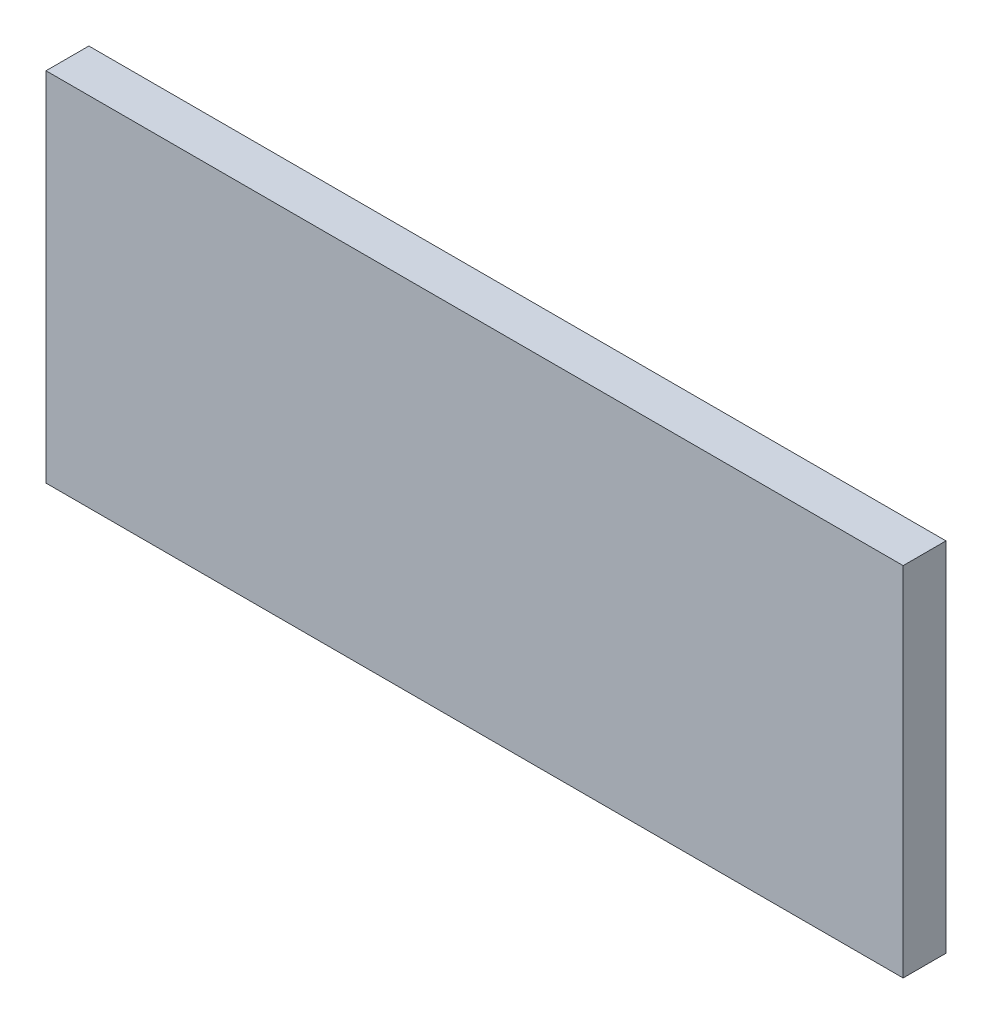
ISO-10303-21;
HEADER;
FILE_DESCRIPTION(('STEP AP214'),'2;1');
FILE_NAME('part.step','',(''),(''),'','','');
FILE_SCHEMA(('AUTOMOTIVE_DESIGN { 1 0 10303 214 1 1 1 1 }'));
ENDSEC;
DATA;
#1=APPLICATION_CONTEXT('core data for automotive mechanical design processes');
#2=APPLICATION_PROTOCOL_DEFINITION('international standard','automotive_design',2000,#1);
#3=PRODUCT_CONTEXT('',#1,'mechanical');
#4=PRODUCT('Part','Part','',(#3));
#5=PRODUCT_RELATED_PRODUCT_CATEGORY('part','',(#4));
#6=PRODUCT_DEFINITION_FORMATION('','',#4);
#7=PRODUCT_DEFINITION_CONTEXT('part definition',#1,'design');
#8=PRODUCT_DEFINITION('design','',#6,#7);
#9=PRODUCT_DEFINITION_SHAPE('','',#8);
#10=(LENGTH_UNIT() NAMED_UNIT(*) SI_UNIT(.MILLI.,.METRE.));
#11=(NAMED_UNIT(*) PLANE_ANGLE_UNIT() SI_UNIT($,.RADIAN.));
#12=(NAMED_UNIT(*) SI_UNIT($,.STERADIAN.) SOLID_ANGLE_UNIT());
#13=UNCERTAINTY_MEASURE_WITH_UNIT(LENGTH_MEASURE(1.E-05),#10,'distance_accuracy_value','');
#14=(GEOMETRIC_REPRESENTATION_CONTEXT(3) GLOBAL_UNCERTAINTY_ASSIGNED_CONTEXT((#13)) GLOBAL_UNIT_ASSIGNED_CONTEXT((#10,
#11,#12)) REPRESENTATION_CONTEXT('',''));
#15=CARTESIAN_POINT('',(0.,0.,0.));
#16=DIRECTION('',(0.,0.,1.));
#17=DIRECTION('',(1.,0.,0.));
#18=AXIS2_PLACEMENT_3D('',#15,#16,#17);
#19=CARTESIAN_POINT('',(30.,12.5,3.));
#20=DIRECTION('',(-1.,0.,0.));
#21=DIRECTION('',(0.,0.,1.));
#22=AXIS2_PLACEMENT_3D('',#19,#20,#21);
#23=PLANE('',#22);
#24=DIRECTION('',(0.,1.,0.));
#25=VECTOR('',#24,1.);
#26=CARTESIAN_POINT('',(30.,12.5,0.));
#27=LINE('',#26,#25);
#28=CARTESIAN_POINT('',(30.,-12.5,0.));
#29=VERTEX_POINT('',#28);
#30=CARTESIAN_POINT('',(30.,12.5,0.));
#31=VERTEX_POINT('',#30);
#32=EDGE_CURVE('E126',#29,#31,#27,.T.);
#33=ORIENTED_EDGE('',*,*,#32,.T.);
#34=DIRECTION('',(0.,0.,-1.));
#35=VECTOR('',#34,1.);
#36=CARTESIAN_POINT('',(30.,12.5,3.));
#37=LINE('',#36,#35);
#38=CARTESIAN_POINT('',(30.,12.5,3.));
#39=VERTEX_POINT('',#38);
#40=EDGE_CURVE('E12',#39,#31,#37,.T.);
#41=ORIENTED_EDGE('',*,*,#40,.F.);
#42=DIRECTION('',(0.,1.,0.));
#43=VECTOR('',#42,1.);
#44=CARTESIAN_POINT('',(30.,12.5,3.));
#45=LINE('',#44,#43);
#46=CARTESIAN_POINT('',(30.,-12.5,3.));
#47=VERTEX_POINT('',#46);
#48=EDGE_CURVE('E108',#47,#39,#45,.T.);
#49=ORIENTED_EDGE('',*,*,#48,.F.);
#50=DIRECTION('',(0.,0.,-1.));
#51=VECTOR('',#50,1.);
#52=CARTESIAN_POINT('',(30.,-12.5,3.));
#53=LINE('',#52,#51);
#54=EDGE_CURVE('E119',#47,#29,#53,.T.);
#55=ORIENTED_EDGE('',*,*,#54,.T.);
#56=EDGE_LOOP('',(#33,#41,#49,#55));
#57=FACE_BOUND('',#56,.T.);
#58=ADVANCED_FACE('F46',(#57),#23,.F.);
#59=CARTESIAN_POINT('',(-30.,12.5,3.));
#60=DIRECTION('',(0.,-1.,0.));
#61=DIRECTION('',(0.,0.,-1.));
#62=AXIS2_PLACEMENT_3D('',#59,#60,#61);
#63=PLANE('',#62);
#64=DIRECTION('',(-1.,0.,0.));
#65=VECTOR('',#64,1.);
#66=CARTESIAN_POINT('',(-30.,12.5,0.));
#67=LINE('',#66,#65);
#68=CARTESIAN_POINT('',(-30.,12.5,0.));
#69=VERTEX_POINT('',#68);
#70=EDGE_CURVE('E113',#31,#69,#67,.T.);
#71=ORIENTED_EDGE('',*,*,#70,.T.);
#72=DIRECTION('',(0.,0.,-1.));
#73=VECTOR('',#72,1.);
#74=CARTESIAN_POINT('',(-30.,12.5,3.));
#75=LINE('',#74,#73);
#76=CARTESIAN_POINT('',(-30.,12.5,3.));
#77=VERTEX_POINT('',#76);
#78=EDGE_CURVE('E57',#77,#69,#75,.T.);
#79=ORIENTED_EDGE('',*,*,#78,.F.);
#80=DIRECTION('',(-1.,0.,0.));
#81=VECTOR('',#80,1.);
#82=CARTESIAN_POINT('',(-30.,12.5,3.));
#83=LINE('',#82,#81);
#84=EDGE_CURVE('E103',#39,#77,#83,.T.);
#85=ORIENTED_EDGE('',*,*,#84,.F.);
#86=ORIENTED_EDGE('',*,*,#40,.T.);
#87=EDGE_LOOP('',(#71,#79,#85,#86));
#88=FACE_BOUND('',#87,.T.);
#89=ADVANCED_FACE('F112',(#88),#63,.F.);
#90=CARTESIAN_POINT('',(-30.,12.5,3.));
#91=DIRECTION('',(1.,0.,0.));
#92=DIRECTION('',(0.,0.,-1.));
#93=AXIS2_PLACEMENT_3D('',#90,#91,#92);
#94=PLANE('',#93);
#95=DIRECTION('',(0.,-1.,0.));
#96=VECTOR('',#95,1.);
#97=CARTESIAN_POINT('',(-30.,12.5,0.));
#98=LINE('',#97,#96);
#99=CARTESIAN_POINT('',(-30.,-12.5,0.));
#100=VERTEX_POINT('',#99);
#101=EDGE_CURVE('E89',#69,#100,#98,.T.);
#102=ORIENTED_EDGE('',*,*,#101,.T.);
#103=DIRECTION('',(0.,0.,-1.));
#104=VECTOR('',#103,1.);
#105=CARTESIAN_POINT('',(-30.,-12.5,3.));
#106=LINE('',#105,#104);
#107=CARTESIAN_POINT('',(-30.,-12.5,3.));
#108=VERTEX_POINT('',#107);
#109=EDGE_CURVE('E115',#108,#100,#106,.T.);
#110=ORIENTED_EDGE('',*,*,#109,.F.);
#111=DIRECTION('',(0.,-1.,0.));
#112=VECTOR('',#111,1.);
#113=CARTESIAN_POINT('',(-30.,12.5,3.));
#114=LINE('',#113,#112);
#115=EDGE_CURVE('E106',#77,#108,#114,.T.);
#116=ORIENTED_EDGE('',*,*,#115,.F.);
#117=ORIENTED_EDGE('',*,*,#78,.T.);
#118=EDGE_LOOP('',(#102,#110,#116,#117));
#119=FACE_BOUND('',#118,.T.);
#120=ADVANCED_FACE('F116',(#119),#94,.F.);
#121=CARTESIAN_POINT('',(-30.,-12.5,3.));
#122=DIRECTION('',(0.,1.,0.));
#123=DIRECTION('',(0.,0.,1.));
#124=AXIS2_PLACEMENT_3D('',#121,#122,#123);
#125=PLANE('',#124);
#126=DIRECTION('',(1.,0.,0.));
#127=VECTOR('',#126,1.);
#128=CARTESIAN_POINT('',(-30.,-12.5,0.));
#129=LINE('',#128,#127);
#130=EDGE_CURVE('E96',#100,#29,#129,.T.);
#131=ORIENTED_EDGE('',*,*,#130,.T.);
#132=ORIENTED_EDGE('',*,*,#54,.F.);
#133=DIRECTION('',(1.,0.,0.));
#134=VECTOR('',#133,1.);
#135=CARTESIAN_POINT('',(-30.,-12.5,3.));
#136=LINE('',#135,#134);
#137=EDGE_CURVE('E68',#108,#47,#136,.T.);
#138=ORIENTED_EDGE('',*,*,#137,.F.);
#139=ORIENTED_EDGE('',*,*,#109,.T.);
#140=EDGE_LOOP('',(#131,#132,#138,#139));
#141=FACE_BOUND('',#140,.T.);
#142=ADVANCED_FACE('F167',(#141),#125,.F.);
#143=CARTESIAN_POINT('',(0.,0.,3.));
#144=DIRECTION('',(0.,0.,1.));
#145=DIRECTION('',(1.,0.,0.));
#146=AXIS2_PLACEMENT_3D('',#143,#144,#145);
#147=PLANE('',#146);
#148=ORIENTED_EDGE('',*,*,#48,.T.);
#149=ORIENTED_EDGE('',*,*,#84,.T.);
#150=ORIENTED_EDGE('',*,*,#115,.T.);
#151=ORIENTED_EDGE('',*,*,#137,.T.);
#152=EDGE_LOOP('',(#148,#149,#150,#151));
#153=FACE_BOUND('',#152,.T.);
#154=ADVANCED_FACE('F104',(#153),#147,.T.);
#155=CARTESIAN_POINT('',(0.,0.,0.));
#156=DIRECTION('',(0.,0.,1.));
#157=DIRECTION('',(1.,0.,0.));
#158=AXIS2_PLACEMENT_3D('',#155,#156,#157);
#159=PLANE('',#158);
#160=ORIENTED_EDGE('',*,*,#32,.F.);
#161=ORIENTED_EDGE('',*,*,#130,.F.);
#162=ORIENTED_EDGE('',*,*,#101,.F.);
#163=ORIENTED_EDGE('',*,*,#70,.F.);
#164=EDGE_LOOP('',(#160,#161,#162,#163));
#165=FACE_BOUND('',#164,.T.);
#166=ADVANCED_FACE('F161',(#165),#159,.F.);
#167=CLOSED_SHELL('',(#58,#89,#120,#142,#154,#166));
#168=MANIFOLD_SOLID_BREP('B2',#167);
#169=ADVANCED_BREP_SHAPE_REPRESENTATION('',(#18,#168),#14);
#170=SHAPE_DEFINITION_REPRESENTATION(#9,#169);
ENDSEC;
END-ISO-10303-21;
